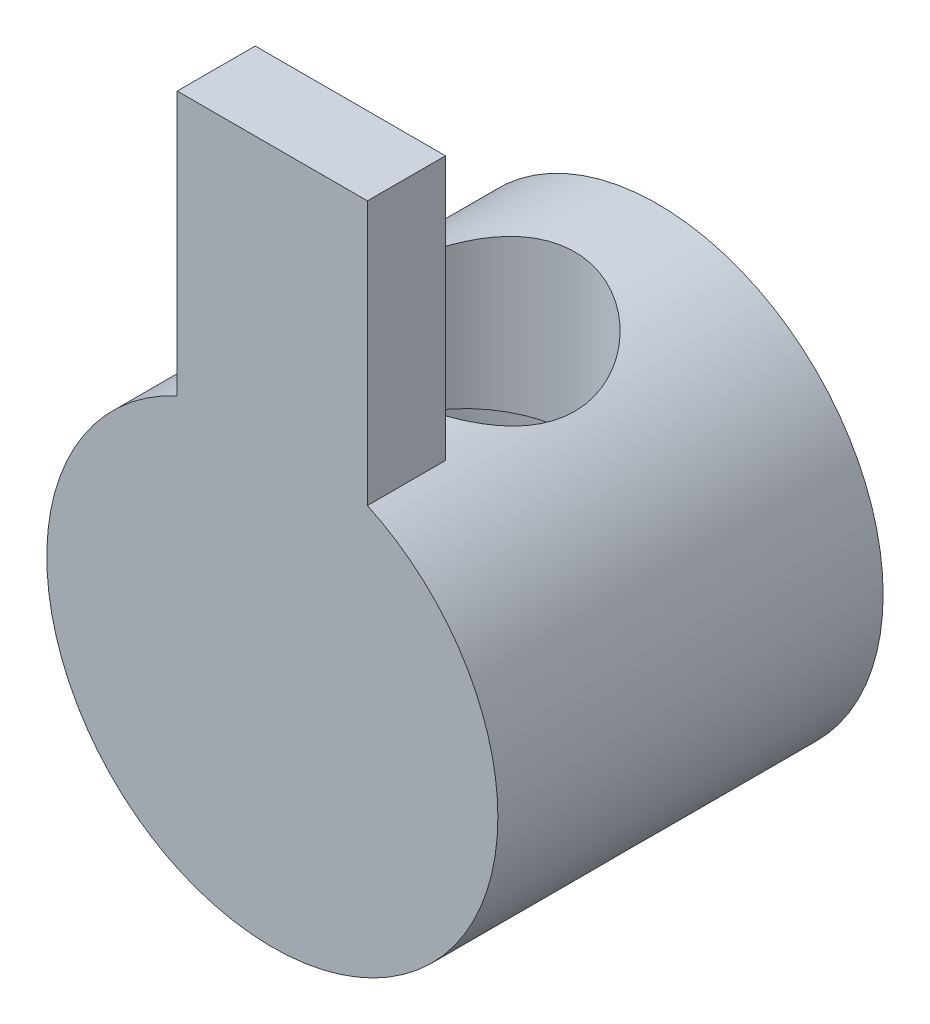
ISO-10303-21;
HEADER;
FILE_DESCRIPTION(('STEP AP214'),'2;1');
FILE_NAME('part.step','',(''),(''),'','','');
FILE_SCHEMA(('AUTOMOTIVE_DESIGN { 1 0 10303 214 1 1 1 1 }'));
ENDSEC;
DATA;
#1=APPLICATION_CONTEXT('core data for automotive mechanical design processes');
#2=APPLICATION_PROTOCOL_DEFINITION('international standard','automotive_design',2000,#1);
#3=PRODUCT_CONTEXT('',#1,'mechanical');
#4=PRODUCT('Part','Part','',(#3));
#5=PRODUCT_RELATED_PRODUCT_CATEGORY('part','',(#4));
#6=PRODUCT_DEFINITION_FORMATION('','',#4);
#7=PRODUCT_DEFINITION_CONTEXT('part definition',#1,'design');
#8=PRODUCT_DEFINITION('design','',#6,#7);
#9=PRODUCT_DEFINITION_SHAPE('','',#8);
#10=(LENGTH_UNIT() NAMED_UNIT(*) SI_UNIT(.MILLI.,.METRE.));
#11=(NAMED_UNIT(*) PLANE_ANGLE_UNIT() SI_UNIT($,.RADIAN.));
#12=(NAMED_UNIT(*) SI_UNIT($,.STERADIAN.) SOLID_ANGLE_UNIT());
#13=UNCERTAINTY_MEASURE_WITH_UNIT(LENGTH_MEASURE(1.E-05),#10,'distance_accuracy_value','');
#14=(GEOMETRIC_REPRESENTATION_CONTEXT(3) GLOBAL_UNCERTAINTY_ASSIGNED_CONTEXT((#13)) GLOBAL_UNIT_ASSIGNED_CONTEXT((#10,
#11,#12)) REPRESENTATION_CONTEXT('',''));
#15=CARTESIAN_POINT('',(0.,0.,0.));
#16=DIRECTION('',(0.,0.,1.));
#17=DIRECTION('',(1.,0.,0.));
#18=AXIS2_PLACEMENT_3D('',#15,#16,#17);
#19=CARTESIAN_POINT('',(0.,-4.98,-12.6));
#20=DIRECTION('',(0.,0.,1.));
#21=DIRECTION('',(1.,0.,0.));
#22=AXIS2_PLACEMENT_3D('',#19,#20,#21);
#23=CYLINDRICAL_SURFACE('',#22,9.25);
#24=DIRECTION('',(0.,0.,1.));
#25=VECTOR('',#24,1.);
#26=CARTESIAN_POINT('',(3.9,3.40763971567687,-12.6));
#27=LINE('',#26,#25);
#28=CARTESIAN_POINT('',(3.9,3.40763971567687,3.2));
#29=VERTEX_POINT('',#28);
#30=CARTESIAN_POINT('',(3.9,3.40763971567687,0.));
#31=VERTEX_POINT('',#30);
#32=EDGE_CURVE('E78',#29,#31,#27,.F.);
#33=ORIENTED_EDGE('',*,*,#32,.F.);
#34=CARTESIAN_POINT('',(0.,-4.98,3.2));
#35=DIRECTION('',(0.,0.,1.));
#36=DIRECTION('',(1.,0.,0.));
#37=AXIS2_PLACEMENT_3D('',#34,#35,#36);
#38=CIRCLE('',#37,9.25);
#39=CARTESIAN_POINT('',(-3.9,3.40763971567687,3.2));
#40=VERTEX_POINT('',#39);
#41=EDGE_CURVE('E81',#40,#29,#38,.T.);
#42=ORIENTED_EDGE('',*,*,#41,.F.);
#43=DIRECTION('',(0.,0.,1.));
#44=VECTOR('',#43,1.);
#45=CARTESIAN_POINT('',(-3.9,3.40763971567687,-12.6));
#46=LINE('',#45,#44);
#47=CARTESIAN_POINT('',(-3.9,3.40763971567687,0.));
#48=VERTEX_POINT('',#47);
#49=EDGE_CURVE('E84',#48,#40,#46,.T.);
#50=ORIENTED_EDGE('',*,*,#49,.F.);
#51=CARTESIAN_POINT('',(0.,-4.98,0.));
#52=DIRECTION('',(0.,0.,-1.));
#53=DIRECTION('',(-1.,0.,0.));
#54=AXIS2_PLACEMENT_3D('',#51,#52,#53);
#55=CIRCLE('',#54,9.25);
#56=EDGE_CURVE('E44',#48,#31,#55,.T.);
#57=ORIENTED_EDGE('',*,*,#56,.T.);
#58=EDGE_LOOP('',(#33,#42,#50,#57));
#59=FACE_BOUND('',#58,.T.);
#60=CARTESIAN_POINT('',(0.,-4.98,-12.6));
#61=DIRECTION('',(0.,0.,1.));
#62=DIRECTION('',(1.,0.,0.));
#63=AXIS2_PLACEMENT_3D('',#60,#61,#62);
#64=CIRCLE('',#63,9.25);
#65=CARTESIAN_POINT('',(9.25,-4.98,-12.6));
#66=VERTEX_POINT('',#65);
#67=EDGE_CURVE('E90',#66,#66,#64,.T.);
#68=ORIENTED_EDGE('',*,*,#67,.T.);
#69=EDGE_LOOP('',(#68));
#70=FACE_BOUND('',#69,.T.);
#71=CARTESIAN_POINT('',(0.,4.27,-0.200000000000002));
#72=CARTESIAN_POINT('',(0.118721312176334,4.26999945529808,-0.200000611861973));
#73=CARTESIAN_POINT('',(0.237456562330408,4.26770882160804,-0.204703880752085));
#74=CARTESIAN_POINT('',(0.474057471047698,4.25860362268943,-0.223465325771837));
#75=CARTESIAN_POINT('',(0.59192269465938,4.2517869316505,-0.237527897810626));
#76=CARTESIAN_POINT('',(0.826032020960868,4.2337926062833,-0.274873750513345));
#77=CARTESIAN_POINT('',(0.942273333416893,4.22260824126974,-0.298171263269473));
#78=CARTESIAN_POINT('',(1.17216187271765,4.19616113442025,-0.353733871910948));
#79=CARTESIAN_POINT('',(1.28580801838943,4.18089672526883,-0.386002634126193));
#80=CARTESIAN_POINT('',(1.50923619124058,4.14674194515757,-0.459014715385114));
#81=CARTESIAN_POINT('',(1.61903263847487,4.12786732546237,-0.499721282795177));
#82=CARTESIAN_POINT('',(1.83463257485225,4.08690080545778,-0.589310265396064));
#83=CARTESIAN_POINT('',(1.94043454463961,4.06480769616949,-0.638195753908934));
#84=CARTESIAN_POINT('',(2.25083689891986,3.9944693354243,-0.796464942995081));
#85=CARTESIAN_POINT('',(2.44868842864913,3.94212435898297,-0.917545452908393));
#86=CARTESIAN_POINT('',(2.83315098835359,3.82785906580568,-1.19531791520138));
#87=CARTESIAN_POINT('',(3.01843867850927,3.76555887377586,-1.35367167918023));
#88=CARTESIAN_POINT('',(3.3610451887461,3.63969913265637,-1.69792807470057));
#89=CARTESIAN_POINT('',(3.51834390983975,3.57613871470549,-1.88385032903912));
#90=CARTESIAN_POINT('',(3.81193359935746,3.44965423926621,-2.29433751788079));
#91=CARTESIAN_POINT('',(3.94587951770771,3.3871093253427,-2.52072550655813));
#92=CARTESIAN_POINT('',(4.11632791992982,3.30386063267963,-2.8770234384741));
#93=CARTESIAN_POINT('',(4.16807821609284,3.2778653810441,-2.99862018935988));
#94=CARTESIAN_POINT('',(4.26089815742784,3.23035727042334,-3.2466441115535));
#95=CARTESIAN_POINT('',(4.30197397718289,3.20884182156298,-3.37306844161631));
#96=CARTESIAN_POINT('',(4.37086540542241,3.17226775409433,-3.62237017074882));
#97=CARTESIAN_POINT('',(4.39931059294619,3.15690763941808,-3.74502974199705));
#98=CARTESIAN_POINT('',(4.44586616887815,3.1315645367499,-3.99278854040332));
#99=CARTESIAN_POINT('',(4.46398190325645,3.12157876743592,-4.11788647086309));
#100=CARTESIAN_POINT('',(4.48962070326842,3.10739897554171,-4.36942499037299));
#101=CARTESIAN_POINT('',(4.4971493807578,3.10320188459338,-4.4958648322792));
#102=CARTESIAN_POINT('',(4.50151311417873,3.10077266722848,-4.74897943148801));
#103=CARTESIAN_POINT('',(4.49834909676874,3.10254002391638,-4.87565416748315));
#104=CARTESIAN_POINT('',(4.48233079218641,3.11143260914858,-5.11391323871288));
#105=CARTESIAN_POINT('',(4.47060199483892,3.11793531510823,-5.22559806447041));
#106=CARTESIAN_POINT('',(4.43890619839394,3.1353513273979,-5.44745486711314));
#107=CARTESIAN_POINT('',(4.41893659239187,3.14626602940021,-5.55762635386145));
#108=CARTESIAN_POINT('',(4.34697260967913,3.18513247284713,-5.88471998532005));
#109=CARTESIAN_POINT('',(4.28291120440002,3.21921373822119,-6.09839197727015));
#110=CARTESIAN_POINT('',(4.12327319137487,3.30065470836854,-6.51658795303131));
#111=CARTESIAN_POINT('',(4.02699675389271,3.34830542289014,-6.72078258438572));
#112=CARTESIAN_POINT('',(3.80616004181495,3.45151720732025,-7.11110805255803));
#113=CARTESIAN_POINT('',(3.68158714807937,3.50708180238146,-7.29723077697062));
#114=CARTESIAN_POINT('',(3.39040545021309,3.62786574969849,-7.66942307266618));
#115=CARTESIAN_POINT('',(3.2205561242562,3.69344649455149,-7.85284228757721));
#116=CARTESIAN_POINT('',(2.85202437795788,3.82150031451479,-8.18972995319165));
#117=CARTESIAN_POINT('',(2.65332961951624,3.88397204436941,-8.3431855213005));
#118=CARTESIAN_POINT('',(2.3325165319662,3.97181176896794,-8.55052530273809));
#119=CARTESIAN_POINT('',(2.21924685974871,4.00063085633036,-8.61692017637019));
#120=CARTESIAN_POINT('',(1.98671821589733,4.05491403712854,-8.73982902173427));
#121=CARTESIAN_POINT('',(1.86746178336007,4.0803795365543,-8.79634713756248));
#122=CARTESIAN_POINT('',(1.62380042009281,4.12720390904933,-8.89889777941935));
#123=CARTESIAN_POINT('',(1.49939743696092,4.14856431863233,-8.94493422987718));
#124=CARTESIAN_POINT('',(1.24635032223507,4.18654074379037,-9.02599741402761));
#125=CARTESIAN_POINT('',(1.11770665082142,4.2031572722718,-9.0610253379987));
#126=CARTESIAN_POINT('',(0.867668958079449,4.23000428342643,-9.1172658724336));
#127=CARTESIAN_POINT('',(0.74651552675424,4.24063853085478,-9.13935782626139));
#128=CARTESIAN_POINT('',(0.502489744805155,4.25715076885485,-9.17355336100904));
#129=CARTESIAN_POINT('',(0.379617536197196,4.26302915005144,-9.18565776226194));
#130=CARTESIAN_POINT('',(0.133200778353692,4.26986184568961,-9.19972021412506));
#131=CARTESIAN_POINT('',(0.00965648356423673,4.27081790924884,-9.20168186890374));
#132=CARTESIAN_POINT('',(-0.237109723020326,4.26778379530716,-9.19544350667148));
#133=CARTESIAN_POINT('',(-0.360331647447028,4.26379381460897,-9.1872438939766));
#134=CARTESIAN_POINT('',(-0.596511882846531,4.25144720516138,-9.16175221805739));
#135=CARTESIAN_POINT('',(-0.709564482101033,4.2434295155667,-9.14516533586842));
#136=CARTESIAN_POINT('',(-0.93375642373827,4.22343935625619,-9.10353493102061));
#137=CARTESIAN_POINT('',(-1.04489514525634,4.2114656277084,-9.07848871650212));
#138=CARTESIAN_POINT('',(-1.37426678817159,4.17000918106062,-8.99102275372875));
#139=CARTESIAN_POINT('',(-1.58866498464234,4.13497949400332,-8.91625256237223));
#140=CARTESIAN_POINT('',(-2.00793422666611,4.05204563508988,-8.73387015919198));
#141=CARTESIAN_POINT('',(-2.21233520298898,4.00379096392628,-8.62535105489422));
#142=CARTESIAN_POINT('',(-2.60076111137687,3.89913443728397,-8.37952263737417));
#143=CARTESIAN_POINT('',(-2.78477714169102,3.84272904711066,-8.24220082165217));
#144=CARTESIAN_POINT('',(-3.1454806824142,3.72103588860716,-7.92777057914043));
#145=CARTESIAN_POINT('',(-3.31985017934478,3.65541170510625,-7.74813453228481));
#146=CARTESIAN_POINT('',(-3.63701493095519,3.52670099682879,-7.36168400780624));
#147=CARTESIAN_POINT('',(-3.77979120263351,3.46361601627046,-7.15485330842272));
#148=CARTESIAN_POINT('',(-3.96989249237841,3.3750961422448,-6.82300830746857));
#149=CARTESIAN_POINT('',(-4.03019794408651,3.3460912037249,-6.70620865334133));
#150=CARTESIAN_POINT('',(-4.14061681614161,3.29173353805948,-6.46709045675253));
#151=CARTESIAN_POINT('',(-4.19073483951179,3.26637916298363,-6.34477443743251));
#152=CARTESIAN_POINT('',(-4.28019149204497,3.22030460847643,-6.09552276665227));
#153=CARTESIAN_POINT('',(-4.31953836330991,3.19958088790522,-5.96859073210966));
#154=CARTESIAN_POINT('',(-4.38697694478202,3.16361093211942,-5.71101256511108));
#155=CARTESIAN_POINT('',(-4.41507028180257,3.14836390522571,-5.58036697241434));
#156=CARTESIAN_POINT('',(-4.45747921565832,3.12517765328472,-5.32894505708787));
#157=CARTESIAN_POINT('',(-4.47284174571632,3.1166861870801,-5.20839550847635));
#158=CARTESIAN_POINT('',(-4.4937635296519,3.10509337673761,-4.96619460021286));
#159=CARTESIAN_POINT('',(-4.49932369733047,3.10199153016618,-4.84454334432769));
#160=CARTESIAN_POINT('',(-4.50055999200121,3.10130310857302,-4.60121230398321));
#161=CARTESIAN_POINT('',(-4.49623905415359,3.10371489573871,-4.47953253872856));
#162=CARTESIAN_POINT('',(-4.47778369722761,3.11395229281822,-4.23715519176057));
#163=CARTESIAN_POINT('',(-4.46364960422082,3.12177772284745,-4.11645757754713));
#164=CARTESIAN_POINT('',(-4.42739858618325,3.14163949285155,-3.88734365319268));
#165=CARTESIAN_POINT('',(-4.4060735638233,3.15325536766687,-3.77876451781483));
#166=CARTESIAN_POINT('',(-4.35562903820814,3.1803804301557,-3.56391501037167));
#167=CARTESIAN_POINT('',(-4.32650692276998,3.19589092249593,-3.45764542497579));
#168=CARTESIAN_POINT('',(-4.22785509827934,3.24759396411369,-3.14327185475929));
#169=CARTESIAN_POINT('',(-4.1470157531194,3.28897208355043,-2.93945298019815));
#170=CARTESIAN_POINT('',(-3.95144928452732,3.3842749089191,-2.53434148906308));
#171=CARTESIAN_POINT('',(-3.83481033665234,3.43885577419548,-2.33413856098318));
#172=CARTESIAN_POINT('',(-3.57311680639407,3.55321240126791,-1.95483263369154));
#173=CARTESIAN_POINT('',(-3.42804795419993,3.61299076342403,-1.77574030310738));
#174=CARTESIAN_POINT('',(-3.09445928236709,3.73906454059449,-1.42284243694449));
#175=CARTESIAN_POINT('',(-2.90288536672555,3.80533533746586,-1.25190629587883));
#176=CARTESIAN_POINT('',(-2.4916384682441,3.93068434009708,-0.943989841320196));
#177=CARTESIAN_POINT('',(-2.27195129580444,3.98975888409927,-0.807026778340429));
#178=CARTESIAN_POINT('',(-1.92533206856749,4.06819192305955,-0.630599692604744));
#179=CARTESIAN_POINT('',(-1.80676737765515,4.09266673127769,-0.57657205925447));
#180=CARTESIAN_POINT('',(-1.56474774010375,4.1375197947164,-0.478795783543485));
#181=CARTESIAN_POINT('',(-1.44129522259359,4.15790005498014,-0.435042108388168));
#182=CARTESIAN_POINT('',(-1.19070073199895,4.19391572961723,-0.358414024035959));
#183=CARTESIAN_POINT('',(-1.0635677255073,4.20956176092264,-0.325515256512874));
#184=CARTESIAN_POINT('',(-0.806460694421298,4.23568188685431,-0.270906281915016));
#185=CARTESIAN_POINT('',(-0.676488520152392,4.24615925079819,-0.249189001875498));
#186=CARTESIAN_POINT('',(-0.455277313718547,4.25923358133066,-0.222162931674963));
#187=CARTESIAN_POINT('',(-0.364476027179,4.26326508020606,-0.213857763601006));
#188=CARTESIAN_POINT('',(-0.182452577809262,4.2686485336199,-0.202775990886128));
#189=CARTESIAN_POINT('',(-0.091230404110744,4.27000041857166,-0.199999529819764));
#190=CARTESIAN_POINT('',(0.,4.27,-0.200000000000002));
#191=B_SPLINE_CURVE_WITH_KNOTS('',3,(#71,#72,#73,#74,#75,#76,#77,#78,#79,#80,#81,#82,#83,#84,
#85,#86,#87,#88,#89,#90,#91,#92,#93,#94,#95,#96,#97,#98,#99,#100,#101,#102,#103,#104,#105,#106,
#107,#108,#109,#110,#111,#112,#113,#114,#115,#116,#117,#118,#119,#120,#121,#122,#123,#124,#125,
#126,#127,#128,#129,#130,#131,#132,#133,#134,#135,#136,#137,#138,#139,#140,#141,#142,#143,#144,
#145,#146,#147,#148,#149,#150,#151,#152,#153,#154,#155,#156,#157,#158,#159,#160,#161,#162,#163,
#164,#165,#166,#167,#168,#169,#170,#171,#172,#173,#174,#175,#176,#177,#178,#179,#180,#181,#182,
#183,#184,#185,#186,#187,#188,#189,#190),.UNSPECIFIED.,.T.,.F.,(4,2,2,2,2,2,2,2,2,2,2,2,2,2,2,2,
2,2,2,2,2,2,2,2,2,2,2,2,2,2,2,2,2,2,2,2,2,2,2,2,2,2,2,2,2,2,2,2,2,2,2,2,2,2,2,2,2,2,2,4),(0.,
0.356073610097669,0.712314580188072,1.06910670593527,1.42604485876801,1.78145982706808,
2.13700864774703,2.8473017984642,3.59891270285233,4.35106118265092,5.15765776763678,
5.56123427448754,5.96457681281938,6.34458877855252,6.72440389157159,7.10401760092291,
7.48359841274552,7.82064828163822,8.1578048550141,8.83161067300995,9.52112334208565,
10.2109441133283,10.9829832861797,11.7553536628121,12.1581660372852,12.5608089915623,
12.9633009439037,13.3657493624934,13.7360853052885,14.1063908273117,14.4765647542827,
14.8467239525342,15.1899429742525,15.5332713153851,16.2193015506898,16.9256450246534,
17.632295740634,18.4054249876314,19.1790175206696,19.5823969234645,19.9855936587298,
20.3884809993003,20.7913100773515,21.156270454451,21.5211968072227,21.8860147735225,
22.2508206182292,22.5842236198932,22.9177384583356,23.58431541958,24.2956754465185,
25.0073934448487,25.7993044297356,26.5916167039576,26.9888795449252,27.3859473750939,
27.7821180304201,28.1780377750871,28.4516524714392,28.7252742731771),.UNSPECIFIED.);
#192=CARTESIAN_POINT('',(0.,4.27,-0.200000000000002));
#193=VERTEX_POINT('',#192);
#194=EDGE_CURVE('E91',#193,#193,#191,.T.);
#195=ORIENTED_EDGE('',*,*,#194,.F.);
#196=EDGE_LOOP('',(#195));
#197=FACE_BOUND('',#196,.T.);
#198=CARTESIAN_POINT('',(0.,-14.23,-11.45));
#199=CARTESIAN_POINT('',(-0.165943842324624,-14.2299984314563,-11.4499983670699));
#200=CARTESIAN_POINT('',(-0.331931036637357,-14.2255234577108,-11.4438695176112));
#201=CARTESIAN_POINT('',(-0.662603075682821,-14.2077248199837,-11.4194473815296));
#202=CARTESIAN_POINT('',(-0.827287072253469,-14.1943958072115,-11.4011467418297));
#203=CARTESIAN_POINT('',(-1.15428694814471,-14.1591727559551,-11.3526304200706));
#204=CARTESIAN_POINT('',(-1.31659765377472,-14.1372622655558,-11.3223918504036));
#205=CARTESIAN_POINT('',(-1.63740397922717,-14.0853737535338,-11.2504542492284));
#206=CARTESIAN_POINT('',(-1.79589787041886,-14.0553921486864,-11.2087501273372));
#207=CARTESIAN_POINT('',(-2.1069862235786,-13.9882329549245,-11.114774814081));
#208=CARTESIAN_POINT('',(-2.25961213236588,-13.9511030062595,-11.0625734843246));
#209=CARTESIAN_POINT('',(-2.55925691317514,-13.8702659545305,-10.948076821919));
#210=CARTESIAN_POINT('',(-2.7062735460835,-13.8265562586885,-10.8857775093696));
#211=CARTESIAN_POINT('',(-3.13764864937316,-13.6868241050211,-10.6848240732834));
#212=CARTESIAN_POINT('',(-3.41274125536737,-13.5821070339948,-10.5319886618845));
#213=CARTESIAN_POINT('',(-3.95809255101226,-13.3461431866071,-10.1782568641753));
#214=CARTESIAN_POINT('',(-4.22562655573141,-13.2133484517905,-9.97425007147972));
#215=CARTESIAN_POINT('',(-4.725166271963,-12.9371829655524,-9.53185244390425));
#216=CARTESIAN_POINT('',(-4.95711491718703,-12.7937957619095,-9.29340754692987));
#217=CARTESIAN_POINT('',(-5.29730250994122,-12.564501593273,-8.88809739564833));
#218=CARTESIAN_POINT('',(-5.41769866612545,-12.4787424838441,-8.73116307724047));
#219=CARTESIAN_POINT('',(-5.64479848480098,-12.3093105501197,-8.40648235219788));
#220=CARTESIAN_POINT('',(-5.75149822963032,-12.225638328238,-8.23873287256225));
#221=CARTESIAN_POINT('',(-5.95043955834904,-12.0631666468608,-7.89288298860271));
#222=CARTESIAN_POINT('',(-6.04269751467093,-11.984361731672,-7.71479462408451));
#223=CARTESIAN_POINT('',(-6.21198208401077,-11.8346724318916,-7.34849310391611));
#224=CARTESIAN_POINT('',(-6.28901717975803,-11.7637836457787,-7.16028566178801));
#225=CARTESIAN_POINT('',(-6.44999727803563,-11.6114523303844,-6.70873863213247));
#226=CARTESIAN_POINT('',(-6.52753182855456,-11.5344959297393,-6.44144289227641));
#227=CARTESIAN_POINT('',(-6.61910070341962,-11.4415698501378,-6.03031747951745));
#228=CARTESIAN_POINT('',(-6.64549404115158,-11.4143543984324,-5.89165503434519));
#229=CARTESIAN_POINT('',(-6.68965942524204,-11.3684254110125,-5.61160007633456));
#230=CARTESIAN_POINT('',(-6.70743577168125,-11.349707635055,-5.47020896187172));
#231=CARTESIAN_POINT('',(-6.73412721392766,-11.321483677924,-5.18453635617327));
#232=CARTESIAN_POINT('',(-6.74297135728832,-11.3120512692444,-5.04024086677406));
#233=CARTESIAN_POINT('',(-6.75135612671584,-11.303110751872,-4.75107199369832));
#234=CARTESIAN_POINT('',(-6.75089710422595,-11.3036022682856,-4.60619863205863));
#235=CARTESIAN_POINT('',(-6.74068275636643,-11.3144889331242,-4.3170699181505));
#236=CARTESIAN_POINT('',(-6.73092170234227,-11.3248901844568,-4.1728150017465));
#237=CARTESIAN_POINT('',(-6.70231256132241,-11.3551026311003,-3.88620877942199));
#238=CARTESIAN_POINT('',(-6.6834634599778,-11.3749148768016,-3.74385768781724));
#239=CARTESIAN_POINT('',(-6.63444277233403,-11.4257777567057,-3.44624860843295));
#240=CARTESIAN_POINT('',(-6.6032380242657,-11.4578399893373,-3.2913346826085));
#241=CARTESIAN_POINT('',(-6.53065388359858,-11.5310081316014,-2.98602486692926));
#242=CARTESIAN_POINT('',(-6.48926767025175,-11.5721201018662,-2.83563208197518));
#243=CARTESIAN_POINT('',(-6.39688626851069,-11.6618030808157,-2.53981368651825));
#244=CARTESIAN_POINT('',(-6.34587342144995,-11.7103877663351,-2.39439779385698));
#245=CARTESIAN_POINT('',(-6.23488621514091,-11.8133317445756,-2.10922732613575));
#246=CARTESIAN_POINT('',(-6.17491431543103,-11.8676894512427,-1.96947121063414));
#247=CARTESIAN_POINT('',(-6.0244830471468,-12.00006204684,-1.64888678327621));
#248=CARTESIAN_POINT('',(-5.93061328459451,-12.0798075292012,-1.47036735635117));
#249=CARTESIAN_POINT('',(-5.72840696800981,-12.2439401282371,-1.12395510494319));
#250=CARTESIAN_POINT('',(-5.62006583815834,-12.3283287080666,-0.956065666495028));
#251=CARTESIAN_POINT('',(-5.38940231969706,-12.4991394994581,-0.631021246578724));
#252=CARTESIAN_POINT('',(-5.26706722574048,-12.5855635015773,-0.473876230264252));
#253=CARTESIAN_POINT('',(-5.00891100635551,-12.7580079750317,-0.170881261674174));
#254=CARTESIAN_POINT('',(-4.87309138980756,-12.8440284903903,-0.0250300488970346));
#255=CARTESIAN_POINT('',(-4.58637838392326,-13.0146644262326,0.25666742200479));
#256=CARTESIAN_POINT('',(-4.43530898463894,-13.099246086342,0.39235535457529));
#257=CARTESIAN_POINT('',(-4.1199691640285,-13.2637175422154,0.650690934583873));
#258=CARTESIAN_POINT('',(-3.95569735183776,-13.3436068421041,0.773337204922178));
#259=CARTESIAN_POINT('',(-3.61480479862082,-13.4964849034245,1.00420713075457));
#260=CARTESIAN_POINT('',(-3.43820870362143,-13.5694867871818,1.11245838061257));
#261=CARTESIAN_POINT('',(-3.07319185527258,-13.7067386326245,1.31343113306558));
#262=CARTESIAN_POINT('',(-2.88477558389495,-13.7709918826643,1.40615847366702));
#263=CARTESIAN_POINT('',(-2.54697747447708,-13.8737115639935,1.55300733496548));
#264=CARTESIAN_POINT('',(-2.3999635406121,-13.9145669492155,1.61093300658345));
#265=CARTESIAN_POINT('',(-2.10072677566552,-13.9896183675947,1.71674497028525));
#266=CARTESIAN_POINT('',(-1.94850509921891,-14.023815865799,1.76463347119524));
#267=CARTESIAN_POINT('',(-1.63975051415671,-14.0848596140033,1.84975939466391));
#268=CARTESIAN_POINT('',(-1.48321990018315,-14.1117096964563,1.88700237044167));
#269=CARTESIAN_POINT('',(-1.16676945142922,-14.157510834091,1.95035221558551));
#270=CARTESIAN_POINT('',(-1.00684952820877,-14.176461682884,1.97645879398376));
#271=CARTESIAN_POINT('',(-0.684167636022165,-14.2060913787456,2.01721364172196));
#272=CARTESIAN_POINT('',(-0.521397176671298,-14.21673851931,2.03181799355064));
#273=CARTESIAN_POINT('',(-0.19488784916109,-14.2293896789304,2.049166234679));
#274=CARTESIAN_POINT('',(-0.0311489826012414,-14.2313937122582,2.05191014356276));
#275=CARTESIAN_POINT('',(0.295974168065758,-14.2267107209532,2.04549211100486));
#276=CARTESIAN_POINT('',(0.459358440364219,-14.2200234111987,2.03632977897571));
#277=CARTESIAN_POINT('',(0.78445611370459,-14.1981164017709,2.00624904188758));
#278=CARTESIAN_POINT('',(0.946169560832893,-14.1828969380835,1.98533096197389));
#279=CARTESIAN_POINT('',(1.25734374318779,-14.145407744051,1.93362613827637));
#280=CARTESIAN_POINT('',(1.40696889590537,-14.1236011332407,1.90348633751711));
#281=CARTESIAN_POINT('',(1.70279271529884,-14.073157973752,1.83346090018126));
#282=CARTESIAN_POINT('',(1.84899019858215,-14.044519103309,1.79357195049835));
#283=CARTESIAN_POINT('',(2.13708848373635,-13.9809500780904,1.70453553642348));
#284=CARTESIAN_POINT('',(2.27899036155028,-13.9460215142156,1.65539041312303));
#285=CARTESIAN_POINT('',(2.55791638341448,-13.8704712311659,1.54835241032251));
#286=CARTESIAN_POINT('',(2.69493871192258,-13.8298474201394,1.49045631599687));
#287=CARTESIAN_POINT('',(3.11974846638231,-13.6933559175425,1.29432393747198));
#288=CARTESIAN_POINT('',(3.39770938568645,-13.5881473547218,1.14090684449312));
#289=CARTESIAN_POINT('',(3.9247573300263,-13.3610104066766,0.800675121743938));
#290=CARTESIAN_POINT('',(4.17382548388002,-13.2390712061228,0.613838864618017));
#291=CARTESIAN_POINT('',(4.54580366322968,-13.0374781085033,0.293145893986795));
#292=CARTESIAN_POINT('',(4.67872308188027,-12.960871958903,0.168777930795852));
#293=CARTESIAN_POINT('',(4.93359902645209,-12.8058754513925,-0.0896817878223177));
#294=CARTESIAN_POINT('',(5.05555747000324,-12.7274854085948,-0.223771834919009));
#295=CARTESIAN_POINT('',(5.28838370497043,-12.5704701591118,-0.501386321277431));
#296=CARTESIAN_POINT('',(5.39924025734964,-12.4918447954704,-0.644920082210795));
#297=CARTESIAN_POINT('',(5.60941580415822,-12.3362247404239,-0.941022602865267));
#298=CARTESIAN_POINT('',(5.70873629429032,-12.2592298386828,-1.09359018742886));
#299=CARTESIAN_POINT('',(5.88488212643867,-12.1173645373759,-1.38987623202968));
#300=CARTESIAN_POINT('',(5.96298118224052,-12.0521061121938,-1.53265188411564));
#301=CARTESIAN_POINT('',(6.10934709956229,-11.9260567438969,-1.82508944411256));
#302=CARTESIAN_POINT('',(6.17761362149335,-11.8652659551175,-1.97475158962876));
#303=CARTESIAN_POINT('',(6.30364088246428,-11.7500731478931,-2.28051458994657));
#304=CARTESIAN_POINT('',(6.36141866870443,-11.6956608145695,-2.43660448183998));
#305=CARTESIAN_POINT('',(6.46588310920272,-11.5951429532326,-2.75503133261699));
#306=CARTESIAN_POINT('',(6.51257429058517,-11.5490340364517,-2.91736571004121));
#307=CARTESIAN_POINT('',(6.58506605556351,-11.476262724408,-3.21105558453868));
#308=CARTESIAN_POINT('',(6.61320301310475,-11.4475546381504,-3.34132951143612));
#309=CARTESIAN_POINT('',(6.66187130556003,-11.3974134191487,-3.60461224779526));
#310=CARTESIAN_POINT('',(6.68240706765532,-11.3759760523142,-3.73761941752518));
#311=CARTESIAN_POINT('',(6.7155353205381,-11.3411842804359,-4.00553424439698));
#312=CARTESIAN_POINT('',(6.72813612203323,-11.327821419127,-4.1404397613419));
#313=CARTESIAN_POINT('',(6.74519078107874,-11.3096965624874,-4.41134908457841));
#314=CARTESIAN_POINT('',(6.74964460207405,-11.3049346057486,-4.54735289579524));
#315=CARTESIAN_POINT('',(6.7503150681832,-11.3042190774909,-4.81964771562553));
#316=CARTESIAN_POINT('',(6.74651697666805,-11.3082812645146,-4.95593880308836));
#317=CARTESIAN_POINT('',(6.73073139560532,-11.32506779267,-5.2274999705749));
#318=CARTESIAN_POINT('',(6.71874393883744,-11.3377920991298,-5.36277005468322));
#319=CARTESIAN_POINT('',(6.68679029214961,-11.3713903050205,-5.63148588793477));
#320=CARTESIAN_POINT('',(6.66681507735199,-11.3922734219752,-5.76492939636499));
#321=CARTESIAN_POINT('',(6.61921140682057,-11.4414012774202,-6.02912579886484));
#322=CARTESIAN_POINT('',(6.59157843071816,-11.4696503634508,-6.15987705457414));
#323=CARTESIAN_POINT('',(6.5197469116448,-11.5419135694649,-6.45644139602611));
#324=CARTESIAN_POINT('',(6.47306583106446,-11.5881177856863,-6.62112210304593));
#325=CARTESIAN_POINT('',(6.36830603265448,-11.6891330062217,-6.94411122548285));
#326=CARTESIAN_POINT('',(6.31022231293283,-11.7439477855366,-7.10241680752268));
#327=CARTESIAN_POINT('',(6.18332617437793,-11.8601442032425,-7.41238976137245));
#328=CARTESIAN_POINT('',(6.11450070425037,-11.9215338012272,-7.56404876660514));
#329=CARTESIAN_POINT('',(5.9667699740022,-12.048922965175,-7.86031002074111));
#330=CARTESIAN_POINT('',(5.88786538160383,-12.1149222256258,-8.00491273623364));
#331=CARTESIAN_POINT('',(5.71793261033993,-12.2518630659985,-8.29113511820703));
#332=CARTESIAN_POINT('',(5.62661550765079,-12.3228930007289,-8.4325410294083));
#333=CARTESIAN_POINT('',(5.43410208975613,-12.4664875075197,-8.70764800202721));
#334=CARTESIAN_POINT('',(5.33290245594026,-12.5390525886387,-8.8413464511002));
#335=CARTESIAN_POINT('',(5.01477218030987,-12.7569161650448,-9.23065958924483));
#336=CARTESIAN_POINT('',(4.78325076629322,-12.9024326160635,-9.47459179130828));
#337=CARTESIAN_POINT('',(4.38010410965026,-13.1291265674496,-9.84003909921333));
#338=CARTESIAN_POINT('',(4.21989192363297,-13.2134424974456,-9.97244163440414));
#339=CARTESIAN_POINT('',(3.88589586984122,-13.376235918698,-10.2232150958033));
#340=CARTESIAN_POINT('',(3.71210889886525,-13.4547120669245,-10.3415827979794));
#341=CARTESIAN_POINT('',(3.35187752285071,-13.6035362595298,-10.5627683728797));
#342=CARTESIAN_POINT('',(3.16544570239782,-13.6738922022997,-10.665601386542));
#343=CARTESIAN_POINT('',(2.78083606642613,-13.8044334364598,-10.8542885956928));
#344=CARTESIAN_POINT('',(2.58266440775202,-13.8646239963095,-10.9401515902638));
#345=CARTESIAN_POINT('',(2.23400278108562,-13.9574385200638,-11.0714907620715));
#346=CARTESIAN_POINT('',(2.08599472681244,-13.9930325924427,-11.1215062669758));
#347=CARTESIAN_POINT('',(1.78549967590828,-14.0573386336922,-11.2114566997161));
#348=CARTESIAN_POINT('',(1.63301375018658,-14.0860522332617,-11.2513940162413));
#349=CARTESIAN_POINT('',(1.32484008644,-14.1359602737769,-11.3205876423352));
#350=CARTESIAN_POINT('',(1.1691613371249,-14.1571733910806,-11.3498704871239));
#351=CARTESIAN_POINT('',(0.85532853413257,-14.1917211049006,-11.3974678536143));
#352=CARTESIAN_POINT('',(0.697175813919277,-14.2050598050529,-11.4157880883857));
#353=CARTESIAN_POINT('',(0.448933808300003,-14.2195344654995,-11.4356527574781));
#354=CARTESIAN_POINT('',(0.359290090353626,-14.2234556436238,-11.4410294776888));
#355=CARTESIAN_POINT('',(0.179768513844689,-14.2286890622194,-11.4482038519616));
#356=CARTESIAN_POINT('',(0.0898906173375318,-14.2300008496691,-11.4500008845468));
#357=CARTESIAN_POINT('',(0.,-14.23,-11.45));
#358=B_SPLINE_CURVE_WITH_KNOTS('',3,(#198,#199,#200,#201,#202,#203,#204,#205,#206,#207,#208,
#209,#210,#211,#212,#213,#214,#215,#216,#217,#218,#219,#220,#221,#222,#223,#224,#225,#226,#227,
#228,#229,#230,#231,#232,#233,#234,#235,#236,#237,#238,#239,#240,#241,#242,#243,#244,#245,#246,
#247,#248,#249,#250,#251,#252,#253,#254,#255,#256,#257,#258,#259,#260,#261,#262,#263,#264,#265,
#266,#267,#268,#269,#270,#271,#272,#273,#274,#275,#276,#277,#278,#279,#280,#281,#282,#283,#284,
#285,#286,#287,#288,#289,#290,#291,#292,#293,#294,#295,#296,#297,#298,#299,#300,#301,#302,#303,
#304,#305,#306,#307,#308,#309,#310,#311,#312,#313,#314,#315,#316,#317,#318,#319,#320,#321,#322,
#323,#324,#325,#326,#327,#328,#329,#330,#331,#332,#333,#334,#335,#336,#337,#338,#339,#340,#341,
#342,#343,#344,#345,#346,#347,#348,#349,#350,#351,#352,#353,#354,#355,#356,#357),.UNSPECIFIED.,
.T.,.F.,(4,2,2,2,2,2,2,2,2,2,2,2,2,2,2,2,2,2,2,2,2,2,2,2,2,2,2,2,2,2,2,2,2,2,2,2,2,2,2,2,2,2,2,
2,2,2,2,2,2,2,2,2,2,2,2,2,2,2,2,2,2,2,2,2,2,2,2,2,2,2,2,2,2,2,2,2,2,2,2,4),(0.,
0.497734817817617,0.99577059470922,1.49476588797357,1.99398307988826,2.48998171384456,
2.98617631234774,3.9772673612611,5.05866959472847,6.14178828358929,6.78794413490497,
7.43428439992747,8.07988652769477,8.72512788177349,9.58767635428414,10.0184933115666,
10.4490950591971,10.8830909839524,11.3170705137892,11.7513174826802,12.1856129306267,
12.668640447446,13.1519924385547,13.6362398426839,14.1203545493277,14.7701176245814,
15.4200866422154,16.0706505324474,16.7211417082657,17.3802591091644,18.039446038852,
18.697350549712,19.3550070868999,19.8441585734673,20.3332023018128,20.8219904538569,
21.3107913760015,21.8014496979498,22.2921072097173,22.7827808180447,23.2734408557883,
23.7354754151756,24.1976672091368,24.6597422611463,25.1219874791273,26.1213670793508,
27.1213957878981,27.7133836984762,28.3052678379423,28.8977452414755,29.4901457416762,
30.0157294045517,30.5413312153008,31.0660709712974,31.5905960841957,31.9992097746023,
32.4075850993372,32.8155319962996,33.2234807236939,33.6321585826466,34.0408348057878,
34.4499740776524,34.8593553803527,35.3904410601645,35.9217602291706,36.4537300533554,
36.985664653834,37.5332873896704,38.0810946568839,39.1763334511267,39.8484673063913,
40.5207552639536,41.1923836864935,41.8636629457245,42.3438880734363,42.8239992730995,
43.3029064242814,43.7815637792725,44.0511364476269,44.3207559129668),.UNSPECIFIED.);
#359=CARTESIAN_POINT('',(0.,-14.23,-11.45));
#360=VERTEX_POINT('',#359);
#361=EDGE_CURVE('E11',#360,#360,#358,.T.);
#362=ORIENTED_EDGE('',*,*,#361,.T.);
#363=EDGE_LOOP('',(#362));
#364=FACE_BOUND('',#363,.T.);
#365=ADVANCED_FACE('F31',(#59,#70,#197,#364),#23,.T.);
#366=CARTESIAN_POINT('',(3.9,-14.23,3.2));
#367=DIRECTION('',(-1.,0.,0.));
#368=DIRECTION('',(0.,0.,1.));
#369=AXIS2_PLACEMENT_3D('',#366,#367,#368);
#370=PLANE('',#369);
#371=DIRECTION('',(0.,1.,0.));
#372=VECTOR('',#371,1.);
#373=CARTESIAN_POINT('',(3.9,-14.23,3.2));
#374=LINE('',#373,#372);
#375=CARTESIAN_POINT('',(3.9,14.23,3.2));
#376=VERTEX_POINT('',#375);
#377=EDGE_CURVE('E87',#29,#376,#374,.T.);
#378=ORIENTED_EDGE('',*,*,#377,.F.);
#379=ORIENTED_EDGE('',*,*,#32,.T.);
#380=DIRECTION('',(0.,1.,0.));
#381=VECTOR('',#380,1.);
#382=CARTESIAN_POINT('',(3.9,-14.23,0.));
#383=LINE('',#382,#381);
#384=CARTESIAN_POINT('',(3.9,14.23,0.));
#385=VERTEX_POINT('',#384);
#386=EDGE_CURVE('E63',#31,#385,#383,.T.);
#387=ORIENTED_EDGE('',*,*,#386,.T.);
#388=DIRECTION('',(0.,0.,-1.));
#389=VECTOR('',#388,1.);
#390=CARTESIAN_POINT('',(3.9,14.23,3.2));
#391=LINE('',#390,#389);
#392=EDGE_CURVE('E94',#376,#385,#391,.T.);
#393=ORIENTED_EDGE('',*,*,#392,.F.);
#394=EDGE_LOOP('',(#378,#379,#387,#393));
#395=FACE_BOUND('',#394,.T.);
#396=ADVANCED_FACE('F33',(#395),#370,.F.);
#397=CARTESIAN_POINT('',(-3.9,14.23,3.2));
#398=DIRECTION('',(0.,-1.,0.));
#399=DIRECTION('',(0.,0.,-1.));
#400=AXIS2_PLACEMENT_3D('',#397,#398,#399);
#401=PLANE('',#400);
#402=DIRECTION('',(-1.,0.,0.));
#403=VECTOR('',#402,1.);
#404=CARTESIAN_POINT('',(-3.9,14.23,0.));
#405=LINE('',#404,#403);
#406=CARTESIAN_POINT('',(-3.9,14.23,0.));
#407=VERTEX_POINT('',#406);
#408=EDGE_CURVE('E99',#385,#407,#405,.T.);
#409=ORIENTED_EDGE('',*,*,#408,.T.);
#410=DIRECTION('',(0.,0.,-1.));
#411=VECTOR('',#410,1.);
#412=CARTESIAN_POINT('',(-3.9,14.23,3.2));
#413=LINE('',#412,#411);
#414=CARTESIAN_POINT('',(-3.9,14.23,3.2));
#415=VERTEX_POINT('',#414);
#416=EDGE_CURVE('E104',#415,#407,#413,.T.);
#417=ORIENTED_EDGE('',*,*,#416,.F.);
#418=DIRECTION('',(-1.,0.,0.));
#419=VECTOR('',#418,1.);
#420=CARTESIAN_POINT('',(-3.9,14.23,3.2));
#421=LINE('',#420,#419);
#422=EDGE_CURVE('E52',#376,#415,#421,.T.);
#423=ORIENTED_EDGE('',*,*,#422,.F.);
#424=ORIENTED_EDGE('',*,*,#392,.T.);
#425=EDGE_LOOP('',(#409,#417,#423,#424));
#426=FACE_BOUND('',#425,.T.);
#427=ADVANCED_FACE('F141',(#426),#401,.F.);
#428=CARTESIAN_POINT('',(-3.9,-14.23,3.2));
#429=DIRECTION('',(1.,0.,0.));
#430=DIRECTION('',(0.,0.,-1.));
#431=AXIS2_PLACEMENT_3D('',#428,#429,#430);
#432=PLANE('',#431);
#433=DIRECTION('',(0.,-1.,0.));
#434=VECTOR('',#433,1.);
#435=CARTESIAN_POINT('',(-3.9,-14.23,0.));
#436=LINE('',#435,#434);
#437=EDGE_CURVE('E95',#407,#48,#436,.T.);
#438=ORIENTED_EDGE('',*,*,#437,.T.);
#439=ORIENTED_EDGE('',*,*,#49,.T.);
#440=DIRECTION('',(0.,-1.,0.));
#441=VECTOR('',#440,1.);
#442=CARTESIAN_POINT('',(-3.9,-14.23,3.2));
#443=LINE('',#442,#441);
#444=EDGE_CURVE('E89',#415,#40,#443,.T.);
#445=ORIENTED_EDGE('',*,*,#444,.F.);
#446=ORIENTED_EDGE('',*,*,#416,.T.);
#447=EDGE_LOOP('',(#438,#439,#445,#446));
#448=FACE_BOUND('',#447,.T.);
#449=ADVANCED_FACE('F145',(#448),#432,.F.);
#450=CARTESIAN_POINT('',(3.9,14.23,3.2));
#451=DIRECTION('',(0.,0.,-1.));
#452=DIRECTION('',(-1.,0.,0.));
#453=AXIS2_PLACEMENT_3D('',#450,#451,#452);
#454=PLANE('',#453);
#455=ORIENTED_EDGE('',*,*,#41,.T.);
#456=ORIENTED_EDGE('',*,*,#377,.T.);
#457=ORIENTED_EDGE('',*,*,#422,.T.);
#458=ORIENTED_EDGE('',*,*,#444,.T.);
#459=EDGE_LOOP('',(#455,#456,#457,#458));
#460=FACE_BOUND('',#459,.T.);
#461=ADVANCED_FACE('F86',(#460),#454,.F.);
#462=CARTESIAN_POINT('',(3.9,14.23,0.));
#463=DIRECTION('',(0.,0.,-1.));
#464=DIRECTION('',(-1.,0.,0.));
#465=AXIS2_PLACEMENT_3D('',#462,#463,#464);
#466=PLANE('',#465);
#467=ORIENTED_EDGE('',*,*,#56,.F.);
#468=ORIENTED_EDGE('',*,*,#437,.F.);
#469=ORIENTED_EDGE('',*,*,#408,.F.);
#470=ORIENTED_EDGE('',*,*,#386,.F.);
#471=EDGE_LOOP('',(#467,#468,#469,#470));
#472=FACE_BOUND('',#471,.T.);
#473=ADVANCED_FACE('F129',(#472),#466,.T.);
#474=CARTESIAN_POINT('',(0.,-4.98,-12.6));
#475=DIRECTION('',(0.,0.,1.));
#476=DIRECTION('',(1.,0.,0.));
#477=AXIS2_PLACEMENT_3D('',#474,#475,#476);
#478=PLANE('',#477);
#479=ORIENTED_EDGE('',*,*,#67,.F.);
#480=EDGE_LOOP('',(#479));
#481=FACE_BOUND('',#480,.T.);
#482=ADVANCED_FACE('F123',(#481),#478,.F.);
#483=CARTESIAN_POINT('',(0.,-14.23,-4.7));
#484=DIRECTION('',(0.,1.,0.));
#485=DIRECTION('',(0.,0.,1.));
#486=AXIS2_PLACEMENT_3D('',#483,#484,#485);
#487=CYLINDRICAL_SURFACE('',#486,4.5);
#488=CARTESIAN_POINT('',(0.,-2.23,-4.7));
#489=DIRECTION('',(0.,1.,0.));
#490=DIRECTION('',(0.,0.,1.));
#491=AXIS2_PLACEMENT_3D('',#488,#489,#490);
#492=CIRCLE('',#491,4.5);
#493=CARTESIAN_POINT('',(0.,-2.23,-0.200000000000002));
#494=VERTEX_POINT('',#493);
#495=EDGE_CURVE('E115',#494,#494,#492,.F.);
#496=ORIENTED_EDGE('',*,*,#495,.T.);
#497=EDGE_LOOP('',(#496));
#498=FACE_BOUND('',#497,.T.);
#499=ORIENTED_EDGE('',*,*,#194,.T.);
#500=EDGE_LOOP('',(#499));
#501=FACE_BOUND('',#500,.T.);
#502=ADVANCED_FACE('F119',(#498,#501),#487,.F.);
#503=CARTESIAN_POINT('',(0.,-2.23,-4.7));
#504=DIRECTION('',(0.,1.,0.));
#505=DIRECTION('',(0.,0.,1.));
#506=AXIS2_PLACEMENT_3D('',#503,#504,#505);
#507=PLANE('',#506);
#508=CARTESIAN_POINT('',(0.,-2.23,-4.7));
#509=DIRECTION('',(0.,1.,0.));
#510=DIRECTION('',(0.,0.,1.));
#511=AXIS2_PLACEMENT_3D('',#508,#509,#510);
#512=CIRCLE('',#511,6.75);
#513=CARTESIAN_POINT('',(0.,-2.23,2.05));
#514=VERTEX_POINT('',#513);
#515=EDGE_CURVE('E199',#514,#514,#512,.T.);
#516=ORIENTED_EDGE('',*,*,#515,.F.);
#517=EDGE_LOOP('',(#516));
#518=FACE_BOUND('',#517,.T.);
#519=ORIENTED_EDGE('',*,*,#495,.F.);
#520=EDGE_LOOP('',(#519));
#521=FACE_BOUND('',#520,.T.);
#522=ADVANCED_FACE('F122',(#518,#521),#507,.F.);
#523=CARTESIAN_POINT('',(0.,-2.23,-4.7));
#524=DIRECTION('',(0.,-1.,0.));
#525=DIRECTION('',(0.,0.,-1.));
#526=AXIS2_PLACEMENT_3D('',#523,#524,#525);
#527=CYLINDRICAL_SURFACE('',#526,6.75);
#528=ORIENTED_EDGE('',*,*,#515,.T.);
#529=EDGE_LOOP('',(#528));
#530=FACE_BOUND('',#529,.T.);
#531=ORIENTED_EDGE('',*,*,#361,.F.);
#532=EDGE_LOOP('',(#531));
#533=FACE_BOUND('',#532,.T.);
#534=ADVANCED_FACE('F125',(#530,#533),#527,.F.);
#535=CLOSED_SHELL('',(#365,#396,#427,#449,#461,#473,#482,#502,#522,#534));
#536=MANIFOLD_SOLID_BREP('B2',#535);
#537=ADVANCED_BREP_SHAPE_REPRESENTATION('',(#18,#536),#14);
#538=SHAPE_DEFINITION_REPRESENTATION(#9,#537);
ENDSEC;
END-ISO-10303-21;
